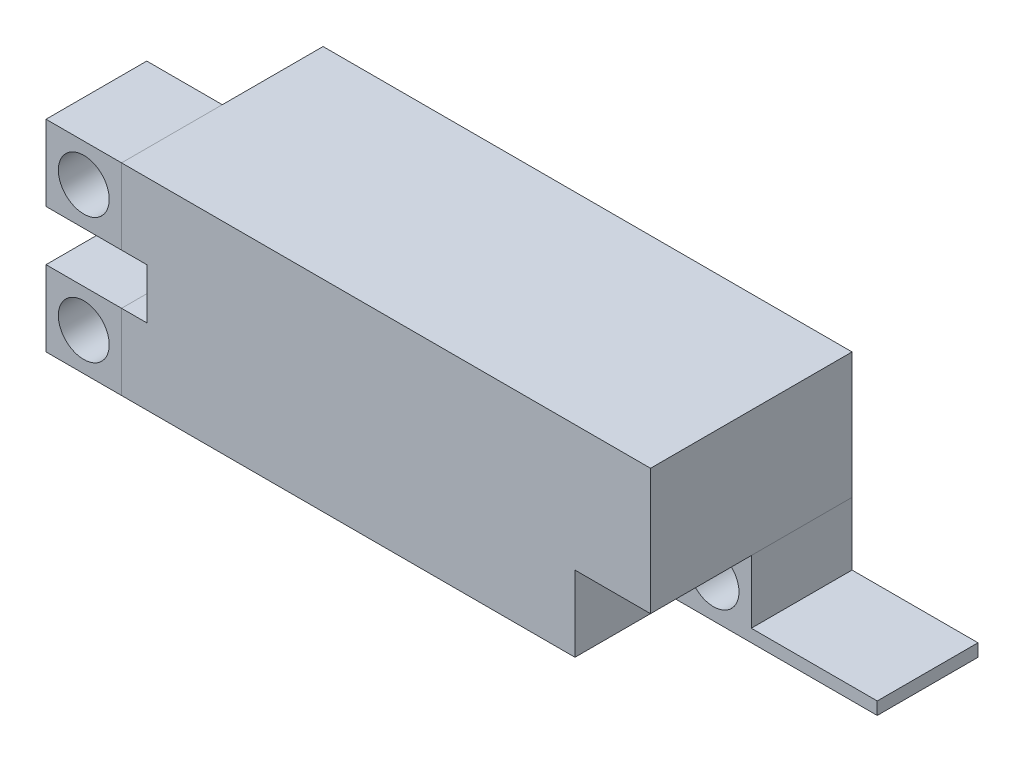
ISO-10303-21;
HEADER;
FILE_DESCRIPTION(('STEP AP214'),'2;1');
FILE_NAME('part.step','',(''),(''),'','','');
FILE_SCHEMA(('AUTOMOTIVE_DESIGN { 1 0 10303 214 1 1 1 1 }'));
ENDSEC;
DATA;
#1=APPLICATION_CONTEXT('core data for automotive mechanical design processes');
#2=APPLICATION_PROTOCOL_DEFINITION('international standard','automotive_design',2000,#1);
#3=PRODUCT_CONTEXT('',#1,'mechanical');
#4=PRODUCT('Part','Part','',(#3));
#5=PRODUCT_RELATED_PRODUCT_CATEGORY('part','',(#4));
#6=PRODUCT_DEFINITION_FORMATION('','',#4);
#7=PRODUCT_DEFINITION_CONTEXT('part definition',#1,'design');
#8=PRODUCT_DEFINITION('design','',#6,#7);
#9=PRODUCT_DEFINITION_SHAPE('','',#8);
#10=(LENGTH_UNIT() NAMED_UNIT(*) SI_UNIT(.MILLI.,.METRE.));
#11=(NAMED_UNIT(*) PLANE_ANGLE_UNIT() SI_UNIT($,.RADIAN.));
#12=(NAMED_UNIT(*) SI_UNIT($,.STERADIAN.) SOLID_ANGLE_UNIT());
#13=UNCERTAINTY_MEASURE_WITH_UNIT(LENGTH_MEASURE(1.E-05),#10,'distance_accuracy_value','');
#14=(GEOMETRIC_REPRESENTATION_CONTEXT(3) GLOBAL_UNCERTAINTY_ASSIGNED_CONTEXT((#13)) GLOBAL_UNIT_ASSIGNED_CONTEXT((#10,
#11,#12)) REPRESENTATION_CONTEXT('',''));
#15=CARTESIAN_POINT('',(0.,0.,0.));
#16=DIRECTION('',(0.,0.,1.));
#17=DIRECTION('',(1.,0.,0.));
#18=AXIS2_PLACEMENT_3D('',#15,#16,#17);
#19=CARTESIAN_POINT('',(15.,20.,20.));
#20=DIRECTION('',(-1.,0.,0.));
#21=DIRECTION('',(0.,0.,1.));
#22=AXIS2_PLACEMENT_3D('',#19,#20,#21);
#23=PLANE('',#22);
#24=DIRECTION('',(0.,-1.,0.));
#25=VECTOR('',#24,1.);
#26=CARTESIAN_POINT('',(15.,40.,20.));
#27=LINE('',#26,#25);
#28=CARTESIAN_POINT('',(15.,40.,20.));
#29=VERTEX_POINT('',#28);
#30=CARTESIAN_POINT('',(15.,25.,20.));
#31=VERTEX_POINT('',#30);
#32=EDGE_CURVE('P0_E90',#29,#31,#27,.T.);
#33=ORIENTED_EDGE('',*,*,#32,.F.);
#34=DIRECTION('',(0.,0.,-1.));
#35=VECTOR('',#34,1.);
#36=CARTESIAN_POINT('',(15.,40.,10.));
#37=LINE('',#36,#35);
#38=CARTESIAN_POINT('',(15.,40.,40.));
#39=VERTEX_POINT('',#38);
#40=EDGE_CURVE('P0_E10',#39,#29,#37,.T.);
#41=ORIENTED_EDGE('',*,*,#40,.F.);
#42=DIRECTION('',(0.,1.,0.));
#43=VECTOR('',#42,1.);
#44=CARTESIAN_POINT('',(15.,20.,40.));
#45=LINE('',#44,#43);
#46=CARTESIAN_POINT('',(15.,25.0000001490116,40.));
#47=VERTEX_POINT('',#46);
#48=EDGE_CURVE('P0_E114',#47,#39,#45,.T.);
#49=ORIENTED_EDGE('',*,*,#48,.F.);
#50=DIRECTION('',(0.,0.,1.));
#51=VECTOR('',#50,1.);
#52=CARTESIAN_POINT('',(15.,25.0000001490116,30.));
#53=LINE('',#52,#51);
#54=EDGE_CURVE('P0_E26',#31,#47,#53,.T.);
#55=ORIENTED_EDGE('',*,*,#54,.F.);
#56=EDGE_LOOP('',(#33,#41,#49,#55));
#57=FACE_BOUND('',#56,.T.);
#58=ADVANCED_FACE('P0_F15',(#57),#23,.F.);
#59=CARTESIAN_POINT('',(120.,40.,0.));
#60=DIRECTION('',(0.,1.,0.));
#61=DIRECTION('',(1.,0.,0.));
#62=AXIS2_PLACEMENT_3D('',#59,#60,#61);
#63=PLANE('',#62);
#64=ORIENTED_EDGE('',*,*,#40,.T.);
#65=DIRECTION('',(-1.,0.,0.));
#66=VECTOR('',#65,1.);
#67=CARTESIAN_POINT('',(60.,40.,20.));
#68=LINE('',#67,#66);
#69=CARTESIAN_POINT('',(0.,40.,20.));
#70=VERTEX_POINT('',#69);
#71=EDGE_CURVE('P0_E19',#29,#70,#68,.T.);
#72=ORIENTED_EDGE('',*,*,#71,.T.);
#73=DIRECTION('',(0.,0.,1.));
#74=VECTOR('',#73,1.);
#75=CARTESIAN_POINT('',(0.,40.,0.));
#76=LINE('',#75,#74);
#77=CARTESIAN_POINT('',(0.,40.,40.));
#78=VERTEX_POINT('',#77);
#79=EDGE_CURVE('P0_E115',#70,#78,#76,.T.);
#80=ORIENTED_EDGE('',*,*,#79,.T.);
#81=DIRECTION('',(1.,0.,0.));
#82=VECTOR('',#81,1.);
#83=CARTESIAN_POINT('',(105.,40.,40.));
#84=LINE('',#83,#82);
#85=EDGE_CURVE('P0_E85',#78,#39,#84,.T.);
#86=ORIENTED_EDGE('',*,*,#85,.T.);
#87=EDGE_LOOP('',(#64,#72,#80,#86));
#88=FACE_BOUND('',#87,.T.);
#89=ADVANCED_FACE('P0_F81',(#88),#63,.T.);
#90=CARTESIAN_POINT('',(0.,25.0000001490116,40.));
#91=DIRECTION('',(0.,1.,0.));
#92=DIRECTION('',(1.,0.,0.));
#93=AXIS2_PLACEMENT_3D('',#90,#91,#92);
#94=PLANE('',#93);
#95=ORIENTED_EDGE('',*,*,#54,.T.);
#96=DIRECTION('',(1.,0.,0.));
#97=VECTOR('',#96,1.);
#98=CARTESIAN_POINT('',(30.,25.0000001490116,40.));
#99=LINE('',#98,#97);
#100=CARTESIAN_POINT('',(0.,25.0000001490116,40.));
#101=VERTEX_POINT('',#100);
#102=EDGE_CURVE('P0_E110',#101,#47,#99,.T.);
#103=ORIENTED_EDGE('',*,*,#102,.F.);
#104=DIRECTION('',(0.,0.,1.));
#105=VECTOR('',#104,1.);
#106=CARTESIAN_POINT('',(0.,25.0000001490116,20.));
#107=LINE('',#106,#105);
#108=CARTESIAN_POINT('',(0.,25.,20.));
#109=VERTEX_POINT('',#108);
#110=EDGE_CURVE('P0_E73',#109,#101,#107,.T.);
#111=ORIENTED_EDGE('',*,*,#110,.F.);
#112=DIRECTION('',(1.,0.,0.));
#113=VECTOR('',#112,1.);
#114=CARTESIAN_POINT('',(0.,25.,20.));
#115=LINE('',#114,#113);
#116=EDGE_CURVE('P0_E93',#109,#31,#115,.T.);
#117=ORIENTED_EDGE('',*,*,#116,.T.);
#118=EDGE_LOOP('',(#95,#103,#111,#117));
#119=FACE_BOUND('',#118,.T.);
#120=ADVANCED_FACE('P0_F138',(#119),#94,.F.);
#121=CARTESIAN_POINT('',(0.,40.,0.));
#122=DIRECTION('',(-1.,0.,0.));
#123=DIRECTION('',(0.,0.,1.));
#124=AXIS2_PLACEMENT_3D('',#121,#122,#123);
#125=PLANE('',#124);
#126=ORIENTED_EDGE('',*,*,#110,.T.);
#127=DIRECTION('',(0.,-1.,0.));
#128=VECTOR('',#127,1.);
#129=CARTESIAN_POINT('',(0.,40.,40.));
#130=LINE('',#129,#128);
#131=EDGE_CURVE('P0_E120',#78,#101,#130,.T.);
#132=ORIENTED_EDGE('',*,*,#131,.F.);
#133=ORIENTED_EDGE('',*,*,#79,.F.);
#134=DIRECTION('',(0.,-1.,0.));
#135=VECTOR('',#134,1.);
#136=CARTESIAN_POINT('',(0.,40.,20.));
#137=LINE('',#136,#135);
#138=EDGE_CURVE('P0_E97',#70,#109,#137,.T.);
#139=ORIENTED_EDGE('',*,*,#138,.T.);
#140=EDGE_LOOP('',(#126,#132,#133,#139));
#141=FACE_BOUND('',#140,.T.);
#142=ADVANCED_FACE('P0_F182',(#141),#125,.T.);
#143=CARTESIAN_POINT('',(7.5,32.5,40.));
#144=DIRECTION('',(0.,0.,-1.));
#145=DIRECTION('',(-1.,0.,0.));
#146=AXIS2_PLACEMENT_3D('',#143,#144,#145);
#147=CYLINDRICAL_SURFACE('',#146,5.05);
#148=CARTESIAN_POINT('',(7.5,32.5,40.));
#149=DIRECTION('',(0.,0.,-1.));
#150=DIRECTION('',(-1.,0.,0.));
#151=AXIS2_PLACEMENT_3D('',#148,#149,#150);
#152=CIRCLE('',#151,5.05);
#153=CARTESIAN_POINT('',(12.55,32.5,40.));
#154=VERTEX_POINT('',#153);
#155=EDGE_CURVE('P0_E103',#154,#154,#152,.T.);
#156=ORIENTED_EDGE('',*,*,#155,.F.);
#157=DIRECTION('',(0.,0.,-1.));
#158=VECTOR('',#157,1.);
#159=CARTESIAN_POINT('',(12.55,32.5,40.));
#160=LINE('',#159,#158);
#161=CARTESIAN_POINT('',(12.55,32.5,20.));
#162=VERTEX_POINT('',#161);
#163=EDGE_CURVE('P0_E40',#154,#162,#160,.T.);
#164=ORIENTED_EDGE('',*,*,#163,.T.);
#165=CARTESIAN_POINT('',(7.5,32.5,20.));
#166=DIRECTION('',(0.,0.,1.));
#167=DIRECTION('',(-1.,0.,0.));
#168=AXIS2_PLACEMENT_3D('',#165,#166,#167);
#169=CIRCLE('',#168,5.05);
#170=EDGE_CURVE('P0_E130',#162,#162,#169,.T.);
#171=ORIENTED_EDGE('',*,*,#170,.F.);
#172=ORIENTED_EDGE('',*,*,#163,.F.);
#173=EDGE_LOOP('',(#156,#164,#171,#172));
#174=FACE_BOUND('',#173,.T.);
#175=ADVANCED_FACE('P0_F194',(#174),#147,.F.);
#176=CARTESIAN_POINT('',(0.,40.,20.));
#177=DIRECTION('',(0.,0.,1.));
#178=DIRECTION('',(1.,0.,0.));
#179=AXIS2_PLACEMENT_3D('',#176,#177,#178);
#180=PLANE('',#179);
#181=ORIENTED_EDGE('',*,*,#170,.T.);
#182=EDGE_LOOP('',(#181));
#183=FACE_BOUND('',#182,.T.);
#184=ORIENTED_EDGE('',*,*,#138,.F.);
#185=ORIENTED_EDGE('',*,*,#71,.F.);
#186=ORIENTED_EDGE('',*,*,#32,.T.);
#187=ORIENTED_EDGE('',*,*,#116,.F.);
#188=EDGE_LOOP('',(#184,#185,#186,#187));
#189=FACE_BOUND('',#188,.T.);
#190=ADVANCED_FACE('P0_F95',(#183,#189),#180,.F.);
#191=CARTESIAN_POINT('',(60.,20.,40.));
#192=DIRECTION('',(0.,0.,1.));
#193=DIRECTION('',(1.,0.,0.));
#194=AXIS2_PLACEMENT_3D('',#191,#192,#193);
#195=PLANE('',#194);
#196=ORIENTED_EDGE('',*,*,#155,.T.);
#197=EDGE_LOOP('',(#196));
#198=FACE_BOUND('',#197,.T.);
#199=ORIENTED_EDGE('',*,*,#48,.T.);
#200=ORIENTED_EDGE('',*,*,#85,.F.);
#201=ORIENTED_EDGE('',*,*,#131,.T.);
#202=ORIENTED_EDGE('',*,*,#102,.T.);
#203=EDGE_LOOP('',(#199,#200,#201,#202));
#204=FACE_BOUND('',#203,.T.);
#205=ADVANCED_FACE('P0_F17',(#198,#204),#195,.T.);
#206=CLOSED_SHELL('',(#58,#89,#120,#142,#175,#190,#205));
#207=MANIFOLD_SOLID_BREP('P0_B1',#206);
#208=CARTESIAN_POINT('',(0.,40.,0.));
#209=DIRECTION('',(-1.,0.,0.));
#210=DIRECTION('',(0.,0.,1.));
#211=AXIS2_PLACEMENT_3D('',#208,#209,#210);
#212=PLANE('',#211);
#213=DIRECTION('',(0.,0.,-1.));
#214=VECTOR('',#213,1.);
#215=CARTESIAN_POINT('',(0.,15.,20.));
#216=LINE('',#215,#214);
#217=CARTESIAN_POINT('',(0.,15.,40.));
#218=VERTEX_POINT('',#217);
#219=CARTESIAN_POINT('',(0.,15.,20.));
#220=VERTEX_POINT('',#219);
#221=EDGE_CURVE('P1_E94',#218,#220,#216,.T.);
#222=ORIENTED_EDGE('',*,*,#221,.T.);
#223=DIRECTION('',(0.,-1.,0.));
#224=VECTOR('',#223,1.);
#225=CARTESIAN_POINT('',(0.,27.5,20.));
#226=LINE('',#225,#224);
#227=CARTESIAN_POINT('',(0.,0.,20.));
#228=VERTEX_POINT('',#227);
#229=EDGE_CURVE('P1_E11',#220,#228,#226,.T.);
#230=ORIENTED_EDGE('',*,*,#229,.T.);
#231=DIRECTION('',(0.,0.,1.));
#232=VECTOR('',#231,1.);
#233=CARTESIAN_POINT('',(0.,0.,0.));
#234=LINE('',#233,#232);
#235=CARTESIAN_POINT('',(0.,0.,40.));
#236=VERTEX_POINT('',#235);
#237=EDGE_CURVE('P1_E116',#228,#236,#234,.T.);
#238=ORIENTED_EDGE('',*,*,#237,.T.);
#239=DIRECTION('',(0.,-1.,0.));
#240=VECTOR('',#239,1.);
#241=CARTESIAN_POINT('',(0.,40.,40.));
#242=LINE('',#241,#240);
#243=EDGE_CURVE('P1_E62',#218,#236,#242,.T.);
#244=ORIENTED_EDGE('',*,*,#243,.F.);
#245=EDGE_LOOP('',(#222,#230,#238,#244));
#246=FACE_BOUND('',#245,.T.);
#247=ADVANCED_FACE('P1_F16',(#246),#212,.T.);
#248=CARTESIAN_POINT('',(0.,15.,20.));
#249=DIRECTION('',(0.,0.,1.));
#250=DIRECTION('',(1.,0.,0.));
#251=AXIS2_PLACEMENT_3D('',#248,#249,#250);
#252=PLANE('',#251);
#253=CARTESIAN_POINT('',(7.5,7.5,20.));
#254=DIRECTION('',(0.,0.,1.));
#255=DIRECTION('',(-1.,0.,0.));
#256=AXIS2_PLACEMENT_3D('',#253,#254,#255);
#257=CIRCLE('',#256,5.05);
#258=CARTESIAN_POINT('',(12.55,7.5,20.));
#259=VERTEX_POINT('',#258);
#260=EDGE_CURVE('P1_E27',#259,#259,#257,.T.);
#261=ORIENTED_EDGE('',*,*,#260,.T.);
#262=EDGE_LOOP('',(#261));
#263=FACE_BOUND('',#262,.T.);
#264=ORIENTED_EDGE('',*,*,#229,.F.);
#265=DIRECTION('',(1.,0.,0.));
#266=VECTOR('',#265,1.);
#267=CARTESIAN_POINT('',(0.,15.,20.));
#268=LINE('',#267,#266);
#269=CARTESIAN_POINT('',(15.,15.,20.));
#270=VERTEX_POINT('',#269);
#271=EDGE_CURVE('P1_E20',#220,#270,#268,.T.);
#272=ORIENTED_EDGE('',*,*,#271,.T.);
#273=DIRECTION('',(0.,-1.,0.));
#274=VECTOR('',#273,1.);
#275=CARTESIAN_POINT('',(15.,0.,20.));
#276=LINE('',#275,#274);
#277=CARTESIAN_POINT('',(15.,0.,20.));
#278=VERTEX_POINT('',#277);
#279=EDGE_CURVE('P1_E107',#270,#278,#276,.T.);
#280=ORIENTED_EDGE('',*,*,#279,.T.);
#281=DIRECTION('',(1.,0.,0.));
#282=VECTOR('',#281,1.);
#283=CARTESIAN_POINT('',(0.,0.,20.));
#284=LINE('',#283,#282);
#285=EDGE_CURVE('P1_E70',#228,#278,#284,.T.);
#286=ORIENTED_EDGE('',*,*,#285,.F.);
#287=EDGE_LOOP('',(#264,#272,#280,#286));
#288=FACE_BOUND('',#287,.T.);
#289=ADVANCED_FACE('P1_F141',(#263,#288),#252,.F.);
#290=CARTESIAN_POINT('',(7.5,7.5,40.));
#291=DIRECTION('',(0.,0.,-1.));
#292=DIRECTION('',(-1.,0.,0.));
#293=AXIS2_PLACEMENT_3D('',#290,#291,#292);
#294=CYLINDRICAL_SURFACE('',#293,5.05);
#295=CARTESIAN_POINT('',(7.5,7.5,40.));
#296=DIRECTION('',(0.,0.,-1.));
#297=DIRECTION('',(-1.,0.,0.));
#298=AXIS2_PLACEMENT_3D('',#295,#296,#297);
#299=CIRCLE('',#298,5.05);
#300=CARTESIAN_POINT('',(12.55,7.5,40.));
#301=VERTEX_POINT('',#300);
#302=EDGE_CURVE('P1_E122',#301,#301,#299,.T.);
#303=ORIENTED_EDGE('',*,*,#302,.F.);
#304=DIRECTION('',(0.,0.,-1.));
#305=VECTOR('',#304,1.);
#306=CARTESIAN_POINT('',(12.55,7.5,40.));
#307=LINE('',#306,#305);
#308=EDGE_CURVE('P1_E119',#301,#259,#307,.T.);
#309=ORIENTED_EDGE('',*,*,#308,.T.);
#310=ORIENTED_EDGE('',*,*,#260,.F.);
#311=ORIENTED_EDGE('',*,*,#308,.F.);
#312=EDGE_LOOP('',(#303,#309,#310,#311));
#313=FACE_BOUND('',#312,.T.);
#314=ADVANCED_FACE('P1_F187',(#313),#294,.F.);
#315=CARTESIAN_POINT('',(20.,15.,40.));
#316=DIRECTION('',(0.,-1.,0.));
#317=DIRECTION('',(0.,0.,-1.));
#318=AXIS2_PLACEMENT_3D('',#315,#316,#317);
#319=PLANE('',#318);
#320=DIRECTION('',(0.,0.,-1.));
#321=VECTOR('',#320,1.);
#322=CARTESIAN_POINT('',(15.,15.,30.));
#323=LINE('',#322,#321);
#324=CARTESIAN_POINT('',(15.,15.,40.));
#325=VERTEX_POINT('',#324);
#326=EDGE_CURVE('P1_E93',#325,#270,#323,.T.);
#327=ORIENTED_EDGE('',*,*,#326,.T.);
#328=ORIENTED_EDGE('',*,*,#271,.F.);
#329=ORIENTED_EDGE('',*,*,#221,.F.);
#330=DIRECTION('',(-1.,0.,0.));
#331=VECTOR('',#330,1.);
#332=CARTESIAN_POINT('',(40.,15.,40.));
#333=LINE('',#332,#331);
#334=EDGE_CURVE('P1_E88',#325,#218,#333,.T.);
#335=ORIENTED_EDGE('',*,*,#334,.F.);
#336=EDGE_LOOP('',(#327,#328,#329,#335));
#337=FACE_BOUND('',#336,.T.);
#338=ADVANCED_FACE('P1_F90',(#337),#319,.F.);
#339=CARTESIAN_POINT('',(60.,20.,40.));
#340=DIRECTION('',(0.,0.,1.));
#341=DIRECTION('',(1.,0.,0.));
#342=AXIS2_PLACEMENT_3D('',#339,#340,#341);
#343=PLANE('',#342);
#344=ORIENTED_EDGE('',*,*,#302,.T.);
#345=EDGE_LOOP('',(#344));
#346=FACE_BOUND('',#345,.T.);
#347=DIRECTION('',(0.,1.,0.));
#348=VECTOR('',#347,1.);
#349=CARTESIAN_POINT('',(15.,20.,40.));
#350=LINE('',#349,#348);
#351=CARTESIAN_POINT('',(15.,0.,40.));
#352=VERTEX_POINT('',#351);
#353=EDGE_CURVE('P1_E97',#352,#325,#350,.T.);
#354=ORIENTED_EDGE('',*,*,#353,.T.);
#355=ORIENTED_EDGE('',*,*,#334,.T.);
#356=ORIENTED_EDGE('',*,*,#243,.T.);
#357=DIRECTION('',(1.,0.,0.));
#358=VECTOR('',#357,1.);
#359=CARTESIAN_POINT('',(0.,0.,40.));
#360=LINE('',#359,#358);
#361=EDGE_CURVE('P1_E100',#236,#352,#360,.T.);
#362=ORIENTED_EDGE('',*,*,#361,.T.);
#363=EDGE_LOOP('',(#354,#355,#356,#362));
#364=FACE_BOUND('',#363,.T.);
#365=ADVANCED_FACE('P1_F98',(#346,#364),#343,.T.);
#366=CARTESIAN_POINT('',(0.,0.,0.));
#367=DIRECTION('',(0.,-1.,0.));
#368=DIRECTION('',(0.,0.,-1.));
#369=AXIS2_PLACEMENT_3D('',#366,#367,#368);
#370=PLANE('',#369);
#371=DIRECTION('',(0.,0.,1.));
#372=VECTOR('',#371,1.);
#373=CARTESIAN_POINT('',(15.,0.,10.));
#374=LINE('',#373,#372);
#375=EDGE_CURVE('P1_E104',#278,#352,#374,.T.);
#376=ORIENTED_EDGE('',*,*,#375,.T.);
#377=ORIENTED_EDGE('',*,*,#361,.F.);
#378=ORIENTED_EDGE('',*,*,#237,.F.);
#379=ORIENTED_EDGE('',*,*,#285,.T.);
#380=EDGE_LOOP('',(#376,#377,#378,#379));
#381=FACE_BOUND('',#380,.T.);
#382=ADVANCED_FACE('P1_F142',(#381),#370,.T.);
#383=CARTESIAN_POINT('',(15.,20.,20.));
#384=DIRECTION('',(-1.,0.,0.));
#385=DIRECTION('',(0.,0.,1.));
#386=AXIS2_PLACEMENT_3D('',#383,#384,#385);
#387=PLANE('',#386);
#388=ORIENTED_EDGE('',*,*,#326,.F.);
#389=ORIENTED_EDGE('',*,*,#353,.F.);
#390=ORIENTED_EDGE('',*,*,#375,.F.);
#391=ORIENTED_EDGE('',*,*,#279,.F.);
#392=EDGE_LOOP('',(#388,#389,#390,#391));
#393=FACE_BOUND('',#392,.T.);
#394=ADVANCED_FACE('P1_F18',(#393),#387,.F.);
#395=CLOSED_SHELL('',(#247,#289,#314,#338,#365,#382,#394));
#396=MANIFOLD_SOLID_BREP('P1_B1',#395);
#397=CARTESIAN_POINT('',(80.,15.,20.));
#398=DIRECTION('',(0.,-1.,0.));
#399=DIRECTION('',(0.,0.,-1.));
#400=AXIS2_PLACEMENT_3D('',#397,#398,#399);
#401=PLANE('',#400);
#402=DIRECTION('',(-1.,0.,0.));
#403=VECTOR('',#402,1.);
#404=CARTESIAN_POINT('',(45.,15.,10.));
#405=LINE('',#404,#403);
#406=CARTESIAN_POINT('',(20.,15.,10.));
#407=VERTEX_POINT('',#406);
#408=CARTESIAN_POINT('',(15.,15.,10.));
#409=VERTEX_POINT('',#408);
#410=EDGE_CURVE('P2_E186',#407,#409,#405,.T.);
#411=ORIENTED_EDGE('',*,*,#410,.T.);
#412=DIRECTION('',(0.,0.,-1.));
#413=VECTOR('',#412,1.);
#414=CARTESIAN_POINT('',(15.,15.,15.));
#415=LINE('',#414,#413);
#416=CARTESIAN_POINT('',(15.,15.,40.));
#417=VERTEX_POINT('',#416);
#418=EDGE_CURVE('P2_E283',#417,#409,#415,.T.);
#419=ORIENTED_EDGE('',*,*,#418,.F.);
#420=DIRECTION('',(-1.,0.,0.));
#421=VECTOR('',#420,1.);
#422=CARTESIAN_POINT('',(70.,15.,40.));
#423=LINE('',#422,#421);
#424=CARTESIAN_POINT('',(20.,15.,40.));
#425=VERTEX_POINT('',#424);
#426=EDGE_CURVE('P2_E11',#425,#417,#423,.T.);
#427=ORIENTED_EDGE('',*,*,#426,.F.);
#428=DIRECTION('',(0.,0.,-1.));
#429=VECTOR('',#428,1.);
#430=CARTESIAN_POINT('',(20.,15.,30.));
#431=LINE('',#430,#429);
#432=EDGE_CURVE('P2_E214',#425,#407,#431,.T.);
#433=ORIENTED_EDGE('',*,*,#432,.T.);
#434=EDGE_LOOP('',(#411,#419,#427,#433));
#435=FACE_BOUND('',#434,.T.);
#436=ADVANCED_FACE('P2_F16',(#435),#401,.F.);
#437=CARTESIAN_POINT('',(60.,20.,40.));
#438=DIRECTION('',(0.,0.,1.));
#439=DIRECTION('',(1.,0.,0.));
#440=AXIS2_PLACEMENT_3D('',#437,#438,#439);
#441=PLANE('',#440);
#442=ORIENTED_EDGE('',*,*,#426,.T.);
#443=DIRECTION('',(0.,1.,0.));
#444=VECTOR('',#443,1.);
#445=CARTESIAN_POINT('',(15.,20.,40.));
#446=LINE('',#445,#444);
#447=CARTESIAN_POINT('',(15.,0.,40.));
#448=VERTEX_POINT('',#447);
#449=EDGE_CURVE('P2_E20',#448,#417,#446,.T.);
#450=ORIENTED_EDGE('',*,*,#449,.F.);
#451=DIRECTION('',(1.,0.,0.));
#452=VECTOR('',#451,1.);
#453=CARTESIAN_POINT('',(0.,0.,40.));
#454=LINE('',#453,#452);
#455=CARTESIAN_POINT('',(105.,0.,40.));
#456=VERTEX_POINT('',#455);
#457=EDGE_CURVE('P2_E102',#448,#456,#454,.T.);
#458=ORIENTED_EDGE('',*,*,#457,.T.);
#459=DIRECTION('',(0.,1.,0.));
#460=VECTOR('',#459,1.);
#461=CARTESIAN_POINT('',(105.,10.,40.));
#462=LINE('',#461,#460);
#463=CARTESIAN_POINT('',(105.,15.,40.));
#464=VERTEX_POINT('',#463);
#465=EDGE_CURVE('P2_E215',#456,#464,#462,.T.);
#466=ORIENTED_EDGE('',*,*,#465,.T.);
#467=DIRECTION('',(-1.,0.,0.));
#468=VECTOR('',#467,1.);
#469=CARTESIAN_POINT('',(70.,15.,40.));
#470=LINE('',#469,#468);
#471=CARTESIAN_POINT('',(120.,15.,40.));
#472=VERTEX_POINT('',#471);
#473=EDGE_CURVE('P2_E173',#472,#464,#470,.T.);
#474=ORIENTED_EDGE('',*,*,#473,.F.);
#475=DIRECTION('',(0.,1.,0.));
#476=VECTOR('',#475,1.);
#477=CARTESIAN_POINT('',(120.,0.,40.));
#478=LINE('',#477,#476);
#479=CARTESIAN_POINT('',(120.,40.,40.));
#480=VERTEX_POINT('',#479);
#481=EDGE_CURVE('P2_E220',#472,#480,#478,.T.);
#482=ORIENTED_EDGE('',*,*,#481,.T.);
#483=DIRECTION('',(1.,0.,0.));
#484=VECTOR('',#483,1.);
#485=CARTESIAN_POINT('',(105.,40.,40.));
#486=LINE('',#485,#484);
#487=CARTESIAN_POINT('',(15.,40.,40.));
#488=VERTEX_POINT('',#487);
#489=EDGE_CURVE('P2_E172',#488,#480,#486,.T.);
#490=ORIENTED_EDGE('',*,*,#489,.F.);
#491=DIRECTION('',(0.,1.,0.));
#492=VECTOR('',#491,1.);
#493=CARTESIAN_POINT('',(15.,20.,40.));
#494=LINE('',#493,#492);
#495=CARTESIAN_POINT('',(15.,25.0000001490116,40.));
#496=VERTEX_POINT('',#495);
#497=EDGE_CURVE('P2_E156',#496,#488,#494,.T.);
#498=ORIENTED_EDGE('',*,*,#497,.F.);
#499=DIRECTION('',(1.,0.,0.));
#500=VECTOR('',#499,1.);
#501=CARTESIAN_POINT('',(30.,25.0000001490116,40.));
#502=LINE('',#501,#500);
#503=CARTESIAN_POINT('',(20.,25.0000001490116,40.));
#504=VERTEX_POINT('',#503);
#505=EDGE_CURVE('P2_E239',#496,#504,#502,.T.);
#506=ORIENTED_EDGE('',*,*,#505,.T.);
#507=DIRECTION('',(0.,-1.,0.));
#508=VECTOR('',#507,1.);
#509=CARTESIAN_POINT('',(20.,22.5000000745058,40.));
#510=LINE('',#509,#508);
#511=EDGE_CURVE('P2_E228',#504,#425,#510,.T.);
#512=ORIENTED_EDGE('',*,*,#511,.T.);
#513=EDGE_LOOP('',(#442,#450,#458,#466,#474,#482,#490,#498,#506,#512));
#514=FACE_BOUND('',#513,.T.);
#515=ADVANCED_FACE('P2_F407',(#514),#441,.T.);
#516=CARTESIAN_POINT('',(60.,20.,0.));
#517=DIRECTION('',(0.,0.,1.));
#518=DIRECTION('',(1.,0.,0.));
#519=AXIS2_PLACEMENT_3D('',#516,#517,#518);
#520=PLANE('',#519);
#521=DIRECTION('',(0.,1.,0.));
#522=VECTOR('',#521,1.);
#523=CARTESIAN_POINT('',(105.,13.75,0.));
#524=LINE('',#523,#522);
#525=CARTESIAN_POINT('',(105.,0.,0.));
#526=VERTEX_POINT('',#525);
#527=CARTESIAN_POINT('',(105.,15.,0.));
#528=VERTEX_POINT('',#527);
#529=EDGE_CURVE('P2_E225',#526,#528,#524,.T.);
#530=ORIENTED_EDGE('',*,*,#529,.F.);
#531=DIRECTION('',(1.,0.,0.));
#532=VECTOR('',#531,1.);
#533=CARTESIAN_POINT('',(0.,0.,0.));
#534=LINE('',#533,#532);
#535=CARTESIAN_POINT('',(15.,0.,0.));
#536=VERTEX_POINT('',#535);
#537=EDGE_CURVE('P2_E27',#536,#526,#534,.T.);
#538=ORIENTED_EDGE('',*,*,#537,.F.);
#539=DIRECTION('',(0.,-1.,0.));
#540=VECTOR('',#539,1.);
#541=CARTESIAN_POINT('',(15.,20.,0.));
#542=LINE('',#541,#540);
#543=CARTESIAN_POINT('',(15.,15.,0.));
#544=VERTEX_POINT('',#543);
#545=EDGE_CURVE('P2_E273',#544,#536,#542,.T.);
#546=ORIENTED_EDGE('',*,*,#545,.F.);
#547=DIRECTION('',(-1.,0.,0.));
#548=VECTOR('',#547,1.);
#549=CARTESIAN_POINT('',(30.,15.,0.));
#550=LINE('',#549,#548);
#551=CARTESIAN_POINT('',(0.,15.,0.));
#552=VERTEX_POINT('',#551);
#553=EDGE_CURVE('P2_E199',#544,#552,#550,.T.);
#554=ORIENTED_EDGE('',*,*,#553,.T.);
#555=DIRECTION('',(0.,-1.,0.));
#556=VECTOR('',#555,1.);
#557=CARTESIAN_POINT('',(0.,40.,0.));
#558=LINE('',#557,#556);
#559=CARTESIAN_POINT('',(0.,25.,0.));
#560=VERTEX_POINT('',#559);
#561=EDGE_CURVE('P2_E269',#560,#552,#558,.T.);
#562=ORIENTED_EDGE('',*,*,#561,.F.);
#563=DIRECTION('',(1.,0.,0.));
#564=VECTOR('',#563,1.);
#565=CARTESIAN_POINT('',(30.,25.,0.));
#566=LINE('',#565,#564);
#567=CARTESIAN_POINT('',(15.,25.,0.));
#568=VERTEX_POINT('',#567);
#569=EDGE_CURVE('P2_E150',#560,#568,#566,.T.);
#570=ORIENTED_EDGE('',*,*,#569,.T.);
#571=DIRECTION('',(0.,-1.,0.));
#572=VECTOR('',#571,1.);
#573=CARTESIAN_POINT('',(15.,20.,0.));
#574=LINE('',#573,#572);
#575=CARTESIAN_POINT('',(15.,40.,0.));
#576=VERTEX_POINT('',#575);
#577=EDGE_CURVE('P2_E144',#576,#568,#574,.T.);
#578=ORIENTED_EDGE('',*,*,#577,.F.);
#579=DIRECTION('',(1.,0.,0.));
#580=VECTOR('',#579,1.);
#581=CARTESIAN_POINT('',(105.,40.,0.));
#582=LINE('',#581,#580);
#583=CARTESIAN_POINT('',(120.,40.,0.));
#584=VERTEX_POINT('',#583);
#585=EDGE_CURVE('P2_E147',#576,#584,#582,.T.);
#586=ORIENTED_EDGE('',*,*,#585,.T.);
#587=DIRECTION('',(0.,-1.,0.));
#588=VECTOR('',#587,1.);
#589=CARTESIAN_POINT('',(120.,0.,0.));
#590=LINE('',#589,#588);
#591=CARTESIAN_POINT('',(120.,15.,0.));
#592=VERTEX_POINT('',#591);
#593=EDGE_CURVE('P2_E166',#584,#592,#590,.T.);
#594=ORIENTED_EDGE('',*,*,#593,.T.);
#595=DIRECTION('',(1.,0.,0.));
#596=VECTOR('',#595,1.);
#597=CARTESIAN_POINT('',(70.,15.,0.));
#598=LINE('',#597,#596);
#599=EDGE_CURVE('P2_E213',#528,#592,#598,.T.);
#600=ORIENTED_EDGE('',*,*,#599,.F.);
#601=EDGE_LOOP('',(#530,#538,#546,#554,#562,#570,#578,#586,#594,#600));
#602=FACE_BOUND('',#601,.T.);
#603=ADVANCED_FACE('P2_F146',(#602),#520,.F.);
#604=CARTESIAN_POINT('',(0.,0.,0.));
#605=DIRECTION('',(0.,-1.,0.));
#606=DIRECTION('',(0.,0.,-1.));
#607=AXIS2_PLACEMENT_3D('',#604,#605,#606);
#608=PLANE('',#607);
#609=DIRECTION('',(0.,0.,-1.));
#610=VECTOR('',#609,1.);
#611=CARTESIAN_POINT('',(105.,0.,10.));
#612=LINE('',#611,#610);
#613=EDGE_CURVE('P2_E219',#456,#526,#612,.T.);
#614=ORIENTED_EDGE('',*,*,#613,.F.);
#615=ORIENTED_EDGE('',*,*,#457,.F.);
#616=DIRECTION('',(0.,0.,1.));
#617=VECTOR('',#616,1.);
#618=CARTESIAN_POINT('',(15.,0.,10.));
#619=LINE('',#618,#617);
#620=EDGE_CURVE('P2_E399',#536,#448,#619,.T.);
#621=ORIENTED_EDGE('',*,*,#620,.F.);
#622=ORIENTED_EDGE('',*,*,#537,.T.);
#623=EDGE_LOOP('',(#614,#615,#621,#622));
#624=FACE_BOUND('',#623,.T.);
#625=ADVANCED_FACE('P2_F411',(#624),#608,.T.);
#626=CARTESIAN_POINT('',(15.,32.5,10.));
#627=DIRECTION('',(1.,0.,0.));
#628=DIRECTION('',(0.,1.,0.));
#629=AXIS2_PLACEMENT_3D('',#626,#627,#628);
#630=PLANE('',#629);
#631=DIRECTION('',(0.,0.,1.));
#632=VECTOR('',#631,1.);
#633=CARTESIAN_POINT('',(15.,25.,15.));
#634=LINE('',#633,#632);
#635=CARTESIAN_POINT('',(15.,25.0000001490116,10.));
#636=VERTEX_POINT('',#635);
#637=EDGE_CURVE('P2_E221',#568,#636,#634,.T.);
#638=ORIENTED_EDGE('',*,*,#637,.T.);
#639=DIRECTION('',(0.,0.,1.));
#640=VECTOR('',#639,1.);
#641=CARTESIAN_POINT('',(15.,25.0000001490116,30.));
#642=LINE('',#641,#640);
#643=EDGE_CURVE('P2_E198',#636,#496,#642,.T.);
#644=ORIENTED_EDGE('',*,*,#643,.T.);
#645=ORIENTED_EDGE('',*,*,#497,.T.);
#646=DIRECTION('',(0.,0.,-1.));
#647=VECTOR('',#646,1.);
#648=CARTESIAN_POINT('',(15.,40.,10.));
#649=LINE('',#648,#647);
#650=EDGE_CURVE('P2_E162',#488,#576,#649,.T.);
#651=ORIENTED_EDGE('',*,*,#650,.T.);
#652=ORIENTED_EDGE('',*,*,#577,.T.);
#653=EDGE_LOOP('',(#638,#644,#645,#651,#652));
#654=FACE_BOUND('',#653,.T.);
#655=ADVANCED_FACE('P2_F168',(#654),#630,.F.);
#656=CARTESIAN_POINT('',(105.,0.,0.));
#657=DIRECTION('',(1.,0.,0.));
#658=DIRECTION('',(0.,1.,0.));
#659=AXIS2_PLACEMENT_3D('',#656,#657,#658);
#660=PLANE('',#659);
#661=DIRECTION('',(0.,0.,1.));
#662=VECTOR('',#661,1.);
#663=CARTESIAN_POINT('',(105.,15.,20.));
#664=LINE('',#663,#662);
#665=EDGE_CURVE('P2_E209',#528,#464,#664,.T.);
#666=ORIENTED_EDGE('',*,*,#665,.T.);
#667=ORIENTED_EDGE('',*,*,#465,.F.);
#668=ORIENTED_EDGE('',*,*,#613,.T.);
#669=ORIENTED_EDGE('',*,*,#529,.T.);
#670=EDGE_LOOP('',(#666,#667,#668,#669));
#671=FACE_BOUND('',#670,.T.);
#672=ADVANCED_FACE('P2_F414',(#671),#660,.T.);
#673=CARTESIAN_POINT('',(120.,40.,40.));
#674=DIRECTION('',(1.,0.,0.));
#675=DIRECTION('',(0.,1.,0.));
#676=AXIS2_PLACEMENT_3D('',#673,#674,#675);
#677=PLANE('',#676);
#678=DIRECTION('',(0.,0.,-1.));
#679=VECTOR('',#678,1.);
#680=CARTESIAN_POINT('',(120.,15.,40.));
#681=LINE('',#680,#679);
#682=EDGE_CURVE('P2_E182',#472,#592,#681,.T.);
#683=ORIENTED_EDGE('',*,*,#682,.T.);
#684=ORIENTED_EDGE('',*,*,#593,.F.);
#685=DIRECTION('',(0.,0.,-1.));
#686=VECTOR('',#685,1.);
#687=CARTESIAN_POINT('',(120.,40.,40.));
#688=LINE('',#687,#686);
#689=EDGE_CURVE('P2_E164',#480,#584,#688,.T.);
#690=ORIENTED_EDGE('',*,*,#689,.F.);
#691=ORIENTED_EDGE('',*,*,#481,.F.);
#692=EDGE_LOOP('',(#683,#684,#690,#691));
#693=FACE_BOUND('',#692,.T.);
#694=ADVANCED_FACE('P2_F423',(#693),#677,.T.);
#695=CARTESIAN_POINT('',(120.,40.,0.));
#696=DIRECTION('',(0.,1.,0.));
#697=DIRECTION('',(1.,0.,0.));
#698=AXIS2_PLACEMENT_3D('',#695,#696,#697);
#699=PLANE('',#698);
#700=ORIENTED_EDGE('',*,*,#650,.F.);
#701=ORIENTED_EDGE('',*,*,#489,.T.);
#702=ORIENTED_EDGE('',*,*,#689,.T.);
#703=ORIENTED_EDGE('',*,*,#585,.F.);
#704=EDGE_LOOP('',(#700,#701,#702,#703));
#705=FACE_BOUND('',#704,.T.);
#706=ADVANCED_FACE('P2_F160',(#705),#699,.T.);
#707=CARTESIAN_POINT('',(120.,15.,40.));
#708=DIRECTION('',(0.,-1.,0.));
#709=DIRECTION('',(0.,0.,-1.));
#710=AXIS2_PLACEMENT_3D('',#707,#708,#709);
#711=PLANE('',#710);
#712=ORIENTED_EDGE('',*,*,#665,.F.);
#713=ORIENTED_EDGE('',*,*,#599,.T.);
#714=ORIENTED_EDGE('',*,*,#682,.F.);
#715=ORIENTED_EDGE('',*,*,#473,.T.);
#716=EDGE_LOOP('',(#712,#713,#714,#715));
#717=FACE_BOUND('',#716,.T.);
#718=ADVANCED_FACE('P2_F419',(#717),#711,.T.);
#719=CARTESIAN_POINT('',(20.,25.0000001490116,40.));
#720=DIRECTION('',(1.,0.,0.));
#721=DIRECTION('',(0.,1.,0.));
#722=AXIS2_PLACEMENT_3D('',#719,#720,#721);
#723=PLANE('',#722);
#724=ORIENTED_EDGE('',*,*,#511,.F.);
#725=DIRECTION('',(0.,0.,-1.));
#726=VECTOR('',#725,1.);
#727=CARTESIAN_POINT('',(20.,25.0000001490116,40.));
#728=LINE('',#727,#726);
#729=CARTESIAN_POINT('',(20.,25.0000001490116,10.));
#730=VERTEX_POINT('',#729);
#731=EDGE_CURVE('P2_E197',#504,#730,#728,.T.);
#732=ORIENTED_EDGE('',*,*,#731,.T.);
#733=DIRECTION('',(0.,-1.,0.));
#734=VECTOR('',#733,1.);
#735=CARTESIAN_POINT('',(20.,25.0000001490116,10.));
#736=LINE('',#735,#734);
#737=EDGE_CURVE('P2_E231',#730,#407,#736,.T.);
#738=ORIENTED_EDGE('',*,*,#737,.T.);
#739=ORIENTED_EDGE('',*,*,#432,.F.);
#740=EDGE_LOOP('',(#724,#732,#738,#739));
#741=FACE_BOUND('',#740,.T.);
#742=ADVANCED_FACE('P2_F18',(#741),#723,.F.);
#743=CARTESIAN_POINT('',(10.,20.0000000745058,10.));
#744=DIRECTION('',(0.,0.,-1.));
#745=DIRECTION('',(0.,-1.,0.));
#746=AXIS2_PLACEMENT_3D('',#743,#744,#745);
#747=PLANE('',#746);
#748=ORIENTED_EDGE('',*,*,#410,.F.);
#749=ORIENTED_EDGE('',*,*,#737,.F.);
#750=DIRECTION('',(1.,0.,0.));
#751=VECTOR('',#750,1.);
#752=CARTESIAN_POINT('',(0.,25.0000001490116,10.));
#753=LINE('',#752,#751);
#754=EDGE_CURVE('P2_E193',#636,#730,#753,.T.);
#755=ORIENTED_EDGE('',*,*,#754,.F.);
#756=DIRECTION('',(1.,0.,0.));
#757=VECTOR('',#756,1.);
#758=CARTESIAN_POINT('',(5.,25.,10.));
#759=LINE('',#758,#757);
#760=CARTESIAN_POINT('',(0.,25.0000001490116,10.));
#761=VERTEX_POINT('',#760);
#762=EDGE_CURVE('P2_E224',#761,#636,#759,.T.);
#763=ORIENTED_EDGE('',*,*,#762,.F.);
#764=DIRECTION('',(0.,1.,0.));
#765=VECTOR('',#764,1.);
#766=CARTESIAN_POINT('',(0.,30.0000000372529,10.));
#767=LINE('',#766,#765);
#768=CARTESIAN_POINT('',(0.,15.,10.));
#769=VERTEX_POINT('',#768);
#770=EDGE_CURVE('P2_E192',#769,#761,#767,.T.);
#771=ORIENTED_EDGE('',*,*,#770,.F.);
#772=DIRECTION('',(-1.,0.,0.));
#773=VECTOR('',#772,1.);
#774=CARTESIAN_POINT('',(5.,15.,10.));
#775=LINE('',#774,#773);
#776=EDGE_CURVE('P2_E205',#409,#769,#775,.T.);
#777=ORIENTED_EDGE('',*,*,#776,.F.);
#778=EDGE_LOOP('',(#748,#749,#755,#763,#771,#777));
#779=FACE_BOUND('',#778,.T.);
#780=ADVANCED_FACE('P2_F383',(#779),#747,.F.);
#781=CARTESIAN_POINT('',(0.,25.0000001490116,40.));
#782=DIRECTION('',(0.,1.,0.));
#783=DIRECTION('',(1.,0.,0.));
#784=AXIS2_PLACEMENT_3D('',#781,#782,#783);
#785=PLANE('',#784);
#786=ORIENTED_EDGE('',*,*,#643,.F.);
#787=ORIENTED_EDGE('',*,*,#754,.T.);
#788=ORIENTED_EDGE('',*,*,#731,.F.);
#789=ORIENTED_EDGE('',*,*,#505,.F.);
#790=EDGE_LOOP('',(#786,#787,#788,#789));
#791=FACE_BOUND('',#790,.T.);
#792=ADVANCED_FACE('P2_F436',(#791),#785,.F.);
#793=CARTESIAN_POINT('',(15.,32.5,10.));
#794=DIRECTION('',(1.,0.,0.));
#795=DIRECTION('',(0.,1.,0.));
#796=AXIS2_PLACEMENT_3D('',#793,#794,#795);
#797=PLANE('',#796);
#798=DIRECTION('',(0.,0.,-1.));
#799=VECTOR('',#798,1.);
#800=CARTESIAN_POINT('',(15.,15.,5.));
#801=LINE('',#800,#799);
#802=EDGE_CURVE('P2_E203',#409,#544,#801,.T.);
#803=ORIENTED_EDGE('',*,*,#802,.T.);
#804=ORIENTED_EDGE('',*,*,#545,.T.);
#805=ORIENTED_EDGE('',*,*,#620,.T.);
#806=ORIENTED_EDGE('',*,*,#449,.T.);
#807=ORIENTED_EDGE('',*,*,#418,.T.);
#808=EDGE_LOOP('',(#803,#804,#805,#806,#807));
#809=FACE_BOUND('',#808,.T.);
#810=ADVANCED_FACE('P2_F406',(#809),#797,.F.);
#811=CARTESIAN_POINT('',(0.,40.,0.));
#812=DIRECTION('',(-1.,0.,0.));
#813=DIRECTION('',(0.,0.,1.));
#814=AXIS2_PLACEMENT_3D('',#811,#812,#813);
#815=PLANE('',#814);
#816=ORIENTED_EDGE('',*,*,#770,.T.);
#817=DIRECTION('',(0.,0.,-1.));
#818=VECTOR('',#817,1.);
#819=CARTESIAN_POINT('',(0.,25.,10.));
#820=LINE('',#819,#818);
#821=EDGE_CURVE('P2_E188',#761,#560,#820,.T.);
#822=ORIENTED_EDGE('',*,*,#821,.T.);
#823=ORIENTED_EDGE('',*,*,#561,.T.);
#824=DIRECTION('',(0.,0.,1.));
#825=VECTOR('',#824,1.);
#826=CARTESIAN_POINT('',(0.,15.,0.));
#827=LINE('',#826,#825);
#828=EDGE_CURVE('P2_E204',#552,#769,#827,.T.);
#829=ORIENTED_EDGE('',*,*,#828,.T.);
#830=EDGE_LOOP('',(#816,#822,#823,#829));
#831=FACE_BOUND('',#830,.T.);
#832=ADVANCED_FACE('P2_F374',(#831),#815,.T.);
#833=CARTESIAN_POINT('',(0.,25.,20.));
#834=DIRECTION('',(0.,-1.,0.));
#835=DIRECTION('',(0.,0.,-1.));
#836=AXIS2_PLACEMENT_3D('',#833,#834,#835);
#837=PLANE('',#836);
#838=ORIENTED_EDGE('',*,*,#762,.T.);
#839=ORIENTED_EDGE('',*,*,#637,.F.);
#840=ORIENTED_EDGE('',*,*,#569,.F.);
#841=ORIENTED_EDGE('',*,*,#821,.F.);
#842=EDGE_LOOP('',(#838,#839,#840,#841));
#843=FACE_BOUND('',#842,.T.);
#844=ADVANCED_FACE('P2_F388',(#843),#837,.F.);
#845=CARTESIAN_POINT('',(0.,15.,0.));
#846=DIRECTION('',(0.,1.,0.));
#847=DIRECTION('',(1.,0.,0.));
#848=AXIS2_PLACEMENT_3D('',#845,#846,#847);
#849=PLANE('',#848);
#850=ORIENTED_EDGE('',*,*,#776,.T.);
#851=ORIENTED_EDGE('',*,*,#828,.F.);
#852=ORIENTED_EDGE('',*,*,#553,.F.);
#853=ORIENTED_EDGE('',*,*,#802,.F.);
#854=EDGE_LOOP('',(#850,#851,#852,#853));
#855=FACE_BOUND('',#854,.T.);
#856=ADVANCED_FACE('P2_F380',(#855),#849,.F.);
#857=CLOSED_SHELL('',(#436,#515,#603,#625,#655,#672,#694,#706,#718,#742,#780,#792,#810,#832,
#844,#856));
#858=MANIFOLD_SOLID_BREP('P2_B1',#857);
#859=CARTESIAN_POINT('',(145.,2.5,0.));
#860=DIRECTION('',(0.,1.,0.));
#861=DIRECTION('',(1.,0.,0.));
#862=AXIS2_PLACEMENT_3D('',#859,#860,#861);
#863=PLANE('',#862);
#864=DIRECTION('',(-1.,0.,0.));
#865=VECTOR('',#864,1.);
#866=CARTESIAN_POINT('',(145.,2.5,0.));
#867=LINE('',#866,#865);
#868=CARTESIAN_POINT('',(145.,2.5,0.));
#869=VERTEX_POINT('',#868);
#870=CARTESIAN_POINT('',(120.,2.5,0.));
#871=VERTEX_POINT('',#870);
#872=EDGE_CURVE('P3_E159',#869,#871,#867,.T.);
#873=ORIENTED_EDGE('',*,*,#872,.T.);
#874=DIRECTION('',(0.,0.,-1.));
#875=VECTOR('',#874,1.);
#876=CARTESIAN_POINT('',(120.,2.5,20.));
#877=LINE('',#876,#875);
#878=CARTESIAN_POINT('',(120.,2.5,20.));
#879=VERTEX_POINT('',#878);
#880=EDGE_CURVE('P3_E26',#879,#871,#877,.T.);
#881=ORIENTED_EDGE('',*,*,#880,.F.);
#882=DIRECTION('',(-1.,0.,0.));
#883=VECTOR('',#882,1.);
#884=CARTESIAN_POINT('',(145.,2.5,20.));
#885=LINE('',#884,#883);
#886=CARTESIAN_POINT('',(145.,2.5,20.));
#887=VERTEX_POINT('',#886);
#888=EDGE_CURVE('P3_E105',#887,#879,#885,.T.);
#889=ORIENTED_EDGE('',*,*,#888,.F.);
#890=DIRECTION('',(0.,0.,1.));
#891=VECTOR('',#890,1.);
#892=CARTESIAN_POINT('',(145.,2.5,0.));
#893=LINE('',#892,#891);
#894=EDGE_CURVE('P3_E10',#869,#887,#893,.T.);
#895=ORIENTED_EDGE('',*,*,#894,.F.);
#896=EDGE_LOOP('',(#873,#881,#889,#895));
#897=FACE_BOUND('',#896,.T.);
#898=ADVANCED_FACE('P3_F15',(#897),#863,.T.);
#899=CARTESIAN_POINT('',(145.,0.,0.));
#900=DIRECTION('',(1.,0.,0.));
#901=DIRECTION('',(0.,1.,0.));
#902=AXIS2_PLACEMENT_3D('',#899,#900,#901);
#903=PLANE('',#902);
#904=DIRECTION('',(0.,1.,0.));
#905=VECTOR('',#904,1.);
#906=CARTESIAN_POINT('',(145.,0.,0.));
#907=LINE('',#906,#905);
#908=CARTESIAN_POINT('',(145.,0.,0.));
#909=VERTEX_POINT('',#908);
#910=EDGE_CURVE('P3_E136',#909,#869,#907,.T.);
#911=ORIENTED_EDGE('',*,*,#910,.T.);
#912=ORIENTED_EDGE('',*,*,#894,.T.);
#913=DIRECTION('',(0.,1.,0.));
#914=VECTOR('',#913,1.);
#915=CARTESIAN_POINT('',(145.,0.,20.));
#916=LINE('',#915,#914);
#917=CARTESIAN_POINT('',(145.,0.,20.));
#918=VERTEX_POINT('',#917);
#919=EDGE_CURVE('P3_E94',#918,#887,#916,.T.);
#920=ORIENTED_EDGE('',*,*,#919,.F.);
#921=DIRECTION('',(0.,0.,1.));
#922=VECTOR('',#921,1.);
#923=CARTESIAN_POINT('',(145.,0.,0.));
#924=LINE('',#923,#922);
#925=EDGE_CURVE('P3_E99',#909,#918,#924,.T.);
#926=ORIENTED_EDGE('',*,*,#925,.F.);
#927=EDGE_LOOP('',(#911,#912,#920,#926));
#928=FACE_BOUND('',#927,.T.);
#929=ADVANCED_FACE('P3_F97',(#928),#903,.T.);
#930=CARTESIAN_POINT('',(120.,40.,40.));
#931=DIRECTION('',(1.,0.,0.));
#932=DIRECTION('',(0.,1.,0.));
#933=AXIS2_PLACEMENT_3D('',#930,#931,#932);
#934=PLANE('',#933);
#935=DIRECTION('',(0.,0.,1.));
#936=VECTOR('',#935,1.);
#937=CARTESIAN_POINT('',(120.,15.,30.));
#938=LINE('',#937,#936);
#939=CARTESIAN_POINT('',(120.,15.,0.));
#940=VERTEX_POINT('',#939);
#941=CARTESIAN_POINT('',(120.,15.,20.));
#942=VERTEX_POINT('',#941);
#943=EDGE_CURVE('P3_E86',#940,#942,#938,.T.);
#944=ORIENTED_EDGE('',*,*,#943,.T.);
#945=DIRECTION('',(0.,1.,0.));
#946=VECTOR('',#945,1.);
#947=CARTESIAN_POINT('',(120.,15.,20.));
#948=LINE('',#947,#946);
#949=EDGE_CURVE('P3_E131',#879,#942,#948,.T.);
#950=ORIENTED_EDGE('',*,*,#949,.F.);
#951=ORIENTED_EDGE('',*,*,#880,.T.);
#952=DIRECTION('',(0.,-1.,0.));
#953=VECTOR('',#952,1.);
#954=CARTESIAN_POINT('',(120.,0.,0.));
#955=LINE('',#954,#953);
#956=EDGE_CURVE('P3_E162',#940,#871,#955,.T.);
#957=ORIENTED_EDGE('',*,*,#956,.F.);
#958=EDGE_LOOP('',(#944,#950,#951,#957));
#959=FACE_BOUND('',#958,.T.);
#960=ADVANCED_FACE('P3_F237',(#959),#934,.T.);
#961=CARTESIAN_POINT('',(112.5,7.5,20.));
#962=DIRECTION('',(0.,0.,-1.));
#963=DIRECTION('',(-1.,0.,0.));
#964=AXIS2_PLACEMENT_3D('',#961,#962,#963);
#965=CYLINDRICAL_SURFACE('',#964,5.05);
#966=CARTESIAN_POINT('',(112.5,7.5,20.));
#967=DIRECTION('',(0.,0.,-1.));
#968=DIRECTION('',(-1.,0.,0.));
#969=AXIS2_PLACEMENT_3D('',#966,#967,#968);
#970=CIRCLE('',#969,5.05);
#971=CARTESIAN_POINT('',(117.55,7.5,20.));
#972=VERTEX_POINT('',#971);
#973=EDGE_CURVE('P3_E170',#972,#972,#970,.T.);
#974=ORIENTED_EDGE('',*,*,#973,.F.);
#975=DIRECTION('',(0.,0.,-1.));
#976=VECTOR('',#975,1.);
#977=CARTESIAN_POINT('',(117.55,7.5,20.));
#978=LINE('',#977,#976);
#979=CARTESIAN_POINT('',(117.55,7.5,0.));
#980=VERTEX_POINT('',#979);
#981=EDGE_CURVE('P3_E19',#972,#980,#978,.T.);
#982=ORIENTED_EDGE('',*,*,#981,.T.);
#983=CARTESIAN_POINT('',(112.5,7.5,0.));
#984=DIRECTION('',(0.,0.,1.));
#985=DIRECTION('',(-1.,0.,0.));
#986=AXIS2_PLACEMENT_3D('',#983,#984,#985);
#987=CIRCLE('',#986,5.05);
#988=EDGE_CURVE('P3_E132',#980,#980,#987,.T.);
#989=ORIENTED_EDGE('',*,*,#988,.F.);
#990=ORIENTED_EDGE('',*,*,#981,.F.);
#991=EDGE_LOOP('',(#974,#982,#989,#990));
#992=FACE_BOUND('',#991,.T.);
#993=ADVANCED_FACE('P3_F243',(#992),#965,.F.);
#994=CARTESIAN_POINT('',(112.5,7.5,20.));
#995=DIRECTION('',(0.,0.,1.));
#996=DIRECTION('',(1.,0.,0.));
#997=AXIS2_PLACEMENT_3D('',#994,#995,#996);
#998=PLANE('',#997);
#999=ORIENTED_EDGE('',*,*,#973,.T.);
#1000=EDGE_LOOP('',(#999));
#1001=FACE_BOUND('',#1000,.T.);
#1002=DIRECTION('',(1.,0.,0.));
#1003=VECTOR('',#1002,1.);
#1004=CARTESIAN_POINT('',(105.,0.,20.));
#1005=LINE('',#1004,#1003);
#1006=CARTESIAN_POINT('',(105.,0.,20.));
#1007=VERTEX_POINT('',#1006);
#1008=EDGE_CURVE('P3_E108',#1007,#918,#1005,.T.);
#1009=ORIENTED_EDGE('',*,*,#1008,.T.);
#1010=ORIENTED_EDGE('',*,*,#919,.T.);
#1011=ORIENTED_EDGE('',*,*,#888,.T.);
#1012=ORIENTED_EDGE('',*,*,#949,.T.);
#1013=DIRECTION('',(1.,0.,0.));
#1014=VECTOR('',#1013,1.);
#1015=CARTESIAN_POINT('',(116.25,15.,20.));
#1016=LINE('',#1015,#1014);
#1017=CARTESIAN_POINT('',(105.,15.,20.));
#1018=VERTEX_POINT('',#1017);
#1019=EDGE_CURVE('P3_E135',#1018,#942,#1016,.T.);
#1020=ORIENTED_EDGE('',*,*,#1019,.F.);
#1021=DIRECTION('',(0.,1.,0.));
#1022=VECTOR('',#1021,1.);
#1023=CARTESIAN_POINT('',(105.,3.75,20.));
#1024=LINE('',#1023,#1022);
#1025=EDGE_CURVE('P3_E111',#1007,#1018,#1024,.T.);
#1026=ORIENTED_EDGE('',*,*,#1025,.F.);
#1027=EDGE_LOOP('',(#1009,#1010,#1011,#1012,#1020,#1026));
#1028=FACE_BOUND('',#1027,.T.);
#1029=ADVANCED_FACE('P3_F109',(#1001,#1028),#998,.T.);
#1030=CARTESIAN_POINT('',(80.,15.,20.));
#1031=DIRECTION('',(0.,-1.,0.));
#1032=DIRECTION('',(0.,0.,-1.));
#1033=AXIS2_PLACEMENT_3D('',#1030,#1031,#1032);
#1034=PLANE('',#1033);
#1035=DIRECTION('',(0.,0.,1.));
#1036=VECTOR('',#1035,1.);
#1037=CARTESIAN_POINT('',(105.,15.,20.));
#1038=LINE('',#1037,#1036);
#1039=CARTESIAN_POINT('',(105.,15.,0.));
#1040=VERTEX_POINT('',#1039);
#1041=EDGE_CURVE('P3_E147',#1040,#1018,#1038,.T.);
#1042=ORIENTED_EDGE('',*,*,#1041,.T.);
#1043=ORIENTED_EDGE('',*,*,#1019,.T.);
#1044=ORIENTED_EDGE('',*,*,#943,.F.);
#1045=DIRECTION('',(1.,0.,0.));
#1046=VECTOR('',#1045,1.);
#1047=CARTESIAN_POINT('',(70.,15.,0.));
#1048=LINE('',#1047,#1046);
#1049=EDGE_CURVE('P3_E116',#1040,#940,#1048,.T.);
#1050=ORIENTED_EDGE('',*,*,#1049,.F.);
#1051=EDGE_LOOP('',(#1042,#1043,#1044,#1050));
#1052=FACE_BOUND('',#1051,.T.);
#1053=ADVANCED_FACE('P3_F17',(#1052),#1034,.F.);
#1054=CARTESIAN_POINT('',(60.,20.,0.));
#1055=DIRECTION('',(0.,0.,1.));
#1056=DIRECTION('',(1.,0.,0.));
#1057=AXIS2_PLACEMENT_3D('',#1054,#1055,#1056);
#1058=PLANE('',#1057);
#1059=ORIENTED_EDGE('',*,*,#988,.T.);
#1060=EDGE_LOOP('',(#1059));
#1061=FACE_BOUND('',#1060,.T.);
#1062=DIRECTION('',(0.,1.,0.));
#1063=VECTOR('',#1062,1.);
#1064=CARTESIAN_POINT('',(105.,13.75,0.));
#1065=LINE('',#1064,#1063);
#1066=CARTESIAN_POINT('',(105.,0.,0.));
#1067=VERTEX_POINT('',#1066);
#1068=EDGE_CURVE('P3_E139',#1067,#1040,#1065,.T.);
#1069=ORIENTED_EDGE('',*,*,#1068,.T.);
#1070=ORIENTED_EDGE('',*,*,#1049,.T.);
#1071=ORIENTED_EDGE('',*,*,#956,.T.);
#1072=ORIENTED_EDGE('',*,*,#872,.F.);
#1073=ORIENTED_EDGE('',*,*,#910,.F.);
#1074=DIRECTION('',(1.,0.,0.));
#1075=VECTOR('',#1074,1.);
#1076=CARTESIAN_POINT('',(0.,0.,0.));
#1077=LINE('',#1076,#1075);
#1078=EDGE_CURVE('P3_E119',#1067,#909,#1077,.T.);
#1079=ORIENTED_EDGE('',*,*,#1078,.F.);
#1080=EDGE_LOOP('',(#1069,#1070,#1071,#1072,#1073,#1079));
#1081=FACE_BOUND('',#1080,.T.);
#1082=ADVANCED_FACE('P3_F302',(#1061,#1081),#1058,.F.);
#1083=CARTESIAN_POINT('',(0.,0.,0.));
#1084=DIRECTION('',(0.,-1.,0.));
#1085=DIRECTION('',(0.,0.,-1.));
#1086=AXIS2_PLACEMENT_3D('',#1083,#1084,#1085);
#1087=PLANE('',#1086);
#1088=DIRECTION('',(0.,0.,-1.));
#1089=VECTOR('',#1088,1.);
#1090=CARTESIAN_POINT('',(105.,0.,10.));
#1091=LINE('',#1090,#1089);
#1092=EDGE_CURVE('P3_E137',#1007,#1067,#1091,.T.);
#1093=ORIENTED_EDGE('',*,*,#1092,.T.);
#1094=ORIENTED_EDGE('',*,*,#1078,.T.);
#1095=ORIENTED_EDGE('',*,*,#925,.T.);
#1096=ORIENTED_EDGE('',*,*,#1008,.F.);
#1097=EDGE_LOOP('',(#1093,#1094,#1095,#1096));
#1098=FACE_BOUND('',#1097,.T.);
#1099=ADVANCED_FACE('P3_F118',(#1098),#1087,.T.);
#1100=CARTESIAN_POINT('',(105.,7.5,20.));
#1101=DIRECTION('',(1.,0.,0.));
#1102=DIRECTION('',(0.,1.,0.));
#1103=AXIS2_PLACEMENT_3D('',#1100,#1101,#1102);
#1104=PLANE('',#1103);
#1105=ORIENTED_EDGE('',*,*,#1041,.F.);
#1106=ORIENTED_EDGE('',*,*,#1068,.F.);
#1107=ORIENTED_EDGE('',*,*,#1092,.F.);
#1108=ORIENTED_EDGE('',*,*,#1025,.T.);
#1109=EDGE_LOOP('',(#1105,#1106,#1107,#1108));
#1110=FACE_BOUND('',#1109,.T.);
#1111=ADVANCED_FACE('P3_F188',(#1110),#1104,.F.);
#1112=CLOSED_SHELL('',(#898,#929,#960,#993,#1029,#1053,#1082,#1099,#1111));
#1113=MANIFOLD_SOLID_BREP('P3_B1',#1112);
#1114=ADVANCED_BREP_SHAPE_REPRESENTATION('',(#18,#207,#396,#858,#1113),#14);
#1115=SHAPE_DEFINITION_REPRESENTATION(#9,#1114);
ENDSEC;
END-ISO-10303-21;
